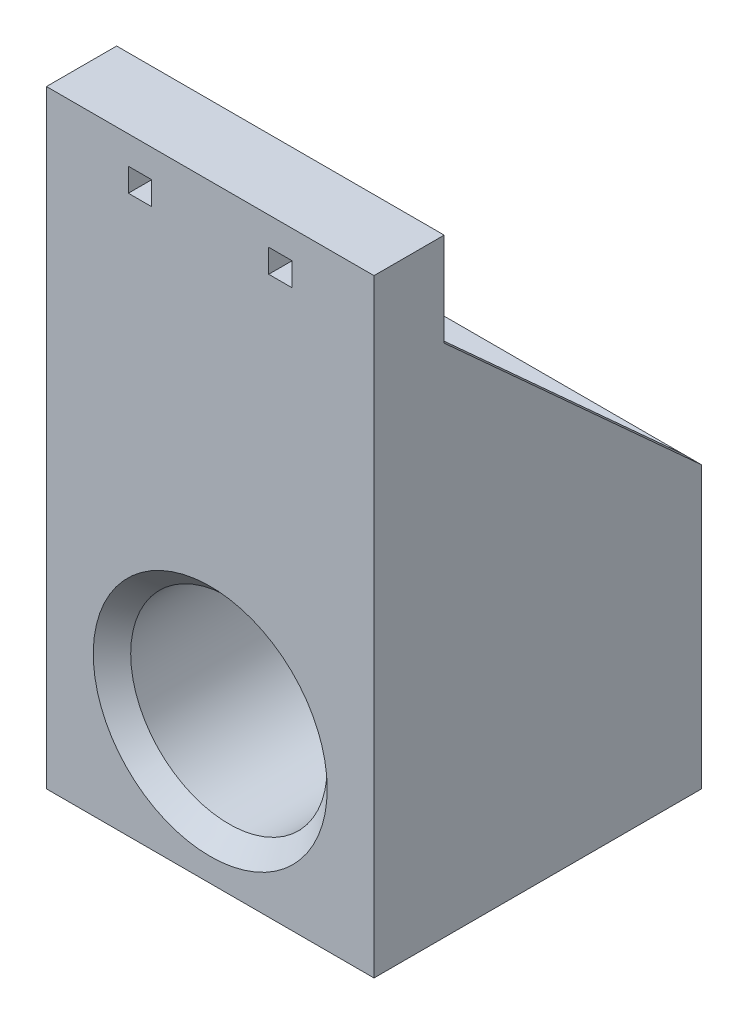
ISO-10303-21;
HEADER;
FILE_DESCRIPTION(('STEP AP214'),'2;1');
FILE_NAME('part.step','',(''),(''),'','','');
FILE_SCHEMA(('AUTOMOTIVE_DESIGN { 1 0 10303 214 1 1 1 1 }'));
ENDSEC;
DATA;
#1=APPLICATION_CONTEXT('core data for automotive mechanical design processes');
#2=APPLICATION_PROTOCOL_DEFINITION('international standard','automotive_design',2000,#1);
#3=PRODUCT_CONTEXT('',#1,'mechanical');
#4=PRODUCT('Part','Part','',(#3));
#5=PRODUCT_RELATED_PRODUCT_CATEGORY('part','',(#4));
#6=PRODUCT_DEFINITION_FORMATION('','',#4);
#7=PRODUCT_DEFINITION_CONTEXT('part definition',#1,'design');
#8=PRODUCT_DEFINITION('design','',#6,#7);
#9=PRODUCT_DEFINITION_SHAPE('','',#8);
#10=(LENGTH_UNIT() NAMED_UNIT(*) SI_UNIT(.MILLI.,.METRE.));
#11=(NAMED_UNIT(*) PLANE_ANGLE_UNIT() SI_UNIT($,.RADIAN.));
#12=(NAMED_UNIT(*) SI_UNIT($,.STERADIAN.) SOLID_ANGLE_UNIT());
#13=UNCERTAINTY_MEASURE_WITH_UNIT(LENGTH_MEASURE(1.E-05),#10,'distance_accuracy_value','');
#14=(GEOMETRIC_REPRESENTATION_CONTEXT(3) GLOBAL_UNCERTAINTY_ASSIGNED_CONTEXT((#13)) GLOBAL_UNIT_ASSIGNED_CONTEXT((#10,
#11,#12)) REPRESENTATION_CONTEXT('',''));
#15=CARTESIAN_POINT('',(0.,0.,0.));
#16=DIRECTION('',(0.,0.,1.));
#17=DIRECTION('',(1.,0.,0.));
#18=AXIS2_PLACEMENT_3D('',#15,#16,#17);
#19=CARTESIAN_POINT('',(35.,0.,35.));
#20=DIRECTION('',(0.,0.,1.));
#21=DIRECTION('',(0.,-1.,0.));
#22=AXIS2_PLACEMENT_3D('',#19,#20,#21);
#23=PLANE('',#22);
#24=DIRECTION('',(-1.,0.,0.));
#25=VECTOR('',#24,1.);
#26=CARTESIAN_POINT('',(17.5,94.,35.));
#27=LINE('',#26,#25);
#28=CARTESIAN_POINT('',(17.5,94.,35.));
#29=VERTEX_POINT('',#28);
#30=CARTESIAN_POINT('',(12.5,94.,35.));
#31=VERTEX_POINT('',#30);
#32=EDGE_CURVE('E60',#29,#31,#27,.T.);
#33=ORIENTED_EDGE('',*,*,#32,.F.);
#34=DIRECTION('',(0.,-1.,0.));
#35=VECTOR('',#34,1.);
#36=CARTESIAN_POINT('',(17.5,94.,35.));
#37=LINE('',#36,#35);
#38=CARTESIAN_POINT('',(17.5,89.,35.));
#39=VERTEX_POINT('',#38);
#40=EDGE_CURVE('E193',#29,#39,#37,.T.);
#41=ORIENTED_EDGE('',*,*,#40,.T.);
#42=DIRECTION('',(-1.,0.,0.));
#43=VECTOR('',#42,1.);
#44=CARTESIAN_POINT('',(17.5,89.,35.));
#45=LINE('',#44,#43);
#46=CARTESIAN_POINT('',(12.5,89.,35.));
#47=VERTEX_POINT('',#46);
#48=EDGE_CURVE('E197',#39,#47,#45,.T.);
#49=ORIENTED_EDGE('',*,*,#48,.T.);
#50=DIRECTION('',(0.,-1.,0.));
#51=VECTOR('',#50,1.);
#52=CARTESIAN_POINT('',(12.5,94.,35.));
#53=LINE('',#52,#51);
#54=EDGE_CURVE('E206',#31,#47,#53,.T.);
#55=ORIENTED_EDGE('',*,*,#54,.F.);
#56=EDGE_LOOP('',(#33,#41,#49,#55));
#57=FACE_BOUND('',#56,.T.);
#58=DIRECTION('',(-1.,0.,0.));
#59=VECTOR('',#58,1.);
#60=CARTESIAN_POINT('',(35.,100.,35.));
#61=LINE('',#60,#59);
#62=CARTESIAN_POINT('',(35.,100.,35.));
#63=VERTEX_POINT('',#62);
#64=CARTESIAN_POINT('',(-35.,100.,35.));
#65=VERTEX_POINT('',#64);
#66=EDGE_CURVE('E334',#63,#65,#61,.T.);
#67=ORIENTED_EDGE('',*,*,#66,.T.);
#68=DIRECTION('',(0.,1.,0.));
#69=VECTOR('',#68,1.);
#70=CARTESIAN_POINT('',(-35.,0.,35.));
#71=LINE('',#70,#69);
#72=CARTESIAN_POINT('',(-35.,-30.,35.));
#73=VERTEX_POINT('',#72);
#74=EDGE_CURVE('E311',#73,#65,#71,.T.);
#75=ORIENTED_EDGE('',*,*,#74,.F.);
#76=DIRECTION('',(-1.,0.,0.));
#77=VECTOR('',#76,1.);
#78=CARTESIAN_POINT('',(35.,-30.,35.));
#79=LINE('',#78,#77);
#80=CARTESIAN_POINT('',(35.,-30.,35.));
#81=VERTEX_POINT('',#80);
#82=EDGE_CURVE('E361',#81,#73,#79,.T.);
#83=ORIENTED_EDGE('',*,*,#82,.F.);
#84=DIRECTION('',(0.,1.,0.));
#85=VECTOR('',#84,1.);
#86=CARTESIAN_POINT('',(35.,0.,35.));
#87=LINE('',#86,#85);
#88=EDGE_CURVE('E320',#81,#63,#87,.T.);
#89=ORIENTED_EDGE('',*,*,#88,.T.);
#90=EDGE_LOOP('',(#67,#75,#83,#89));
#91=FACE_BOUND('',#90,.T.);
#92=CARTESIAN_POINT('',(0.,0.,35.));
#93=DIRECTION('',(0.,0.,1.));
#94=DIRECTION('',(0.,-1.,0.));
#95=AXIS2_PLACEMENT_3D('',#92,#93,#94);
#96=CIRCLE('',#95,25.);
#97=CARTESIAN_POINT('',(0.,-25.,35.));
#98=VERTEX_POINT('',#97);
#99=EDGE_CURVE('E364',#98,#98,#96,.F.);
#100=ORIENTED_EDGE('',*,*,#99,.T.);
#101=EDGE_LOOP('',(#100));
#102=FACE_BOUND('',#101,.T.);
#103=DIRECTION('',(-1.,0.,0.));
#104=VECTOR('',#103,1.);
#105=CARTESIAN_POINT('',(-12.5,94.,35.));
#106=LINE('',#105,#104);
#107=CARTESIAN_POINT('',(-12.5,94.,35.));
#108=VERTEX_POINT('',#107);
#109=CARTESIAN_POINT('',(-17.5,94.,35.));
#110=VERTEX_POINT('',#109);
#111=EDGE_CURVE('E234',#108,#110,#106,.T.);
#112=ORIENTED_EDGE('',*,*,#111,.F.);
#113=DIRECTION('',(0.,-1.,0.));
#114=VECTOR('',#113,1.);
#115=CARTESIAN_POINT('',(-12.5,94.,35.));
#116=LINE('',#115,#114);
#117=CARTESIAN_POINT('',(-12.5,89.,35.));
#118=VERTEX_POINT('',#117);
#119=EDGE_CURVE('E68',#108,#118,#116,.T.);
#120=ORIENTED_EDGE('',*,*,#119,.T.);
#121=DIRECTION('',(-1.,0.,0.));
#122=VECTOR('',#121,1.);
#123=CARTESIAN_POINT('',(-12.5,89.,35.));
#124=LINE('',#123,#122);
#125=CARTESIAN_POINT('',(-17.5,89.,35.));
#126=VERTEX_POINT('',#125);
#127=EDGE_CURVE('E243',#118,#126,#124,.T.);
#128=ORIENTED_EDGE('',*,*,#127,.T.);
#129=DIRECTION('',(0.,-1.,0.));
#130=VECTOR('',#129,1.);
#131=CARTESIAN_POINT('',(-17.5,94.,35.));
#132=LINE('',#131,#130);
#133=EDGE_CURVE('E238',#110,#126,#132,.T.);
#134=ORIENTED_EDGE('',*,*,#133,.F.);
#135=EDGE_LOOP('',(#112,#120,#128,#134));
#136=FACE_BOUND('',#135,.T.);
#137=ADVANCED_FACE('F43',(#57,#91,#102,#136),#23,.T.);
#138=CARTESIAN_POINT('',(35.,30.,0.));
#139=DIRECTION('',(0.,1.,0.));
#140=DIRECTION('',(0.,0.,1.));
#141=AXIS2_PLACEMENT_3D('',#138,#139,#140);
#142=PLANE('',#141);
#143=DIRECTION('',(-1.,0.,0.));
#144=VECTOR('',#143,1.);
#145=CARTESIAN_POINT('',(35.,30.,-35.));
#146=LINE('',#145,#144);
#147=CARTESIAN_POINT('',(31.,30.,-35.));
#148=VERTEX_POINT('',#147);
#149=CARTESIAN_POINT('',(-31.,30.,-35.));
#150=VERTEX_POINT('',#149);
#151=EDGE_CURVE('E354',#148,#150,#146,.T.);
#152=ORIENTED_EDGE('',*,*,#151,.T.);
#153=DIRECTION('',(0.,0.,1.));
#154=VECTOR('',#153,1.);
#155=CARTESIAN_POINT('',(-31.,30.,0.));
#156=LINE('',#155,#154);
#157=CARTESIAN_POINT('',(-31.,30.,30.));
#158=VERTEX_POINT('',#157);
#159=EDGE_CURVE('E266',#150,#158,#156,.T.);
#160=ORIENTED_EDGE('',*,*,#159,.T.);
#161=DIRECTION('',(-1.,0.,0.));
#162=VECTOR('',#161,1.);
#163=CARTESIAN_POINT('',(35.,30.,30.));
#164=LINE('',#163,#162);
#165=CARTESIAN_POINT('',(31.,30.,30.));
#166=VERTEX_POINT('',#165);
#167=EDGE_CURVE('E350',#166,#158,#164,.T.);
#168=ORIENTED_EDGE('',*,*,#167,.F.);
#169=DIRECTION('',(0.,0.,-1.));
#170=VECTOR('',#169,1.);
#171=CARTESIAN_POINT('',(31.,30.,0.));
#172=LINE('',#171,#170);
#173=EDGE_CURVE('E294',#166,#148,#172,.T.);
#174=ORIENTED_EDGE('',*,*,#173,.T.);
#175=EDGE_LOOP('',(#152,#160,#168,#174));
#176=FACE_BOUND('',#175,.T.);
#177=ADVANCED_FACE('F400',(#176),#142,.T.);
#178=CARTESIAN_POINT('',(35.,0.,30.));
#179=DIRECTION('',(0.,0.,1.));
#180=DIRECTION('',(1.,0.,0.));
#181=AXIS2_PLACEMENT_3D('',#178,#179,#180);
#182=PLANE('',#181);
#183=DIRECTION('',(0.,-1.,0.));
#184=VECTOR('',#183,1.);
#185=CARTESIAN_POINT('',(-31.,0.,30.));
#186=LINE('',#185,#184);
#187=CARTESIAN_POINT('',(-31.,80.,30.));
#188=VERTEX_POINT('',#187);
#189=EDGE_CURVE('E272',#188,#158,#186,.T.);
#190=ORIENTED_EDGE('',*,*,#189,.F.);
#191=DIRECTION('',(1.,0.,0.));
#192=VECTOR('',#191,1.);
#193=CARTESIAN_POINT('',(-35.,80.,30.));
#194=LINE('',#193,#192);
#195=CARTESIAN_POINT('',(31.,80.,30.));
#196=VERTEX_POINT('',#195);
#197=EDGE_CURVE('E303',#188,#196,#194,.T.);
#198=ORIENTED_EDGE('',*,*,#197,.T.);
#199=DIRECTION('',(0.,1.,0.));
#200=VECTOR('',#199,1.);
#201=CARTESIAN_POINT('',(31.,0.,30.));
#202=LINE('',#201,#200);
#203=EDGE_CURVE('E287',#166,#196,#202,.T.);
#204=ORIENTED_EDGE('',*,*,#203,.F.);
#205=ORIENTED_EDGE('',*,*,#167,.T.);
#206=EDGE_LOOP('',(#190,#198,#204,#205));
#207=FACE_BOUND('',#206,.T.);
#208=ADVANCED_FACE('F453',(#207),#182,.F.);
#209=CARTESIAN_POINT('',(-35.,80.,30.));
#210=DIRECTION('',(0.,-1.,0.));
#211=DIRECTION('',(0.,0.,-1.));
#212=AXIS2_PLACEMENT_3D('',#209,#210,#211);
#213=PLANE('',#212);
#214=ORIENTED_EDGE('',*,*,#197,.F.);
#215=DIRECTION('',(0.,0.,-1.));
#216=VECTOR('',#215,1.);
#217=CARTESIAN_POINT('',(-31.,80.,30.));
#218=LINE('',#217,#216);
#219=CARTESIAN_POINT('',(-31.,80.,20.));
#220=VERTEX_POINT('',#219);
#221=EDGE_CURVE('E276',#188,#220,#218,.T.);
#222=ORIENTED_EDGE('',*,*,#221,.T.);
#223=DIRECTION('',(1.,0.,0.));
#224=VECTOR('',#223,1.);
#225=CARTESIAN_POINT('',(-35.,80.,20.));
#226=LINE('',#225,#224);
#227=CARTESIAN_POINT('',(31.,80.,20.));
#228=VERTEX_POINT('',#227);
#229=EDGE_CURVE('E316',#220,#228,#226,.T.);
#230=ORIENTED_EDGE('',*,*,#229,.T.);
#231=DIRECTION('',(0.,0.,1.));
#232=VECTOR('',#231,1.);
#233=CARTESIAN_POINT('',(31.,80.,30.));
#234=LINE('',#233,#232);
#235=EDGE_CURVE('E11',#228,#196,#234,.T.);
#236=ORIENTED_EDGE('',*,*,#235,.T.);
#237=EDGE_LOOP('',(#214,#222,#230,#236));
#238=FACE_BOUND('',#237,.T.);
#239=ADVANCED_FACE('F450',(#238),#213,.T.);
#240=CARTESIAN_POINT('',(35.,-30.,0.));
#241=DIRECTION('',(0.,1.,0.));
#242=DIRECTION('',(0.,0.,1.));
#243=AXIS2_PLACEMENT_3D('',#240,#241,#242);
#244=PLANE('',#243);
#245=DIRECTION('',(0.,0.,-1.));
#246=VECTOR('',#245,1.);
#247=CARTESIAN_POINT('',(-35.,-30.,0.));
#248=LINE('',#247,#246);
#249=CARTESIAN_POINT('',(-35.,-30.,-35.));
#250=VERTEX_POINT('',#249);
#251=EDGE_CURVE('E337',#73,#250,#248,.T.);
#252=ORIENTED_EDGE('',*,*,#251,.T.);
#253=DIRECTION('',(-1.,0.,0.));
#254=VECTOR('',#253,1.);
#255=CARTESIAN_POINT('',(35.,-30.,-35.));
#256=LINE('',#255,#254);
#257=CARTESIAN_POINT('',(35.,-30.,-35.));
#258=VERTEX_POINT('',#257);
#259=EDGE_CURVE('E358',#258,#250,#256,.T.);
#260=ORIENTED_EDGE('',*,*,#259,.F.);
#261=DIRECTION('',(0.,0.,-1.));
#262=VECTOR('',#261,1.);
#263=CARTESIAN_POINT('',(35.,-30.,0.));
#264=LINE('',#263,#262);
#265=EDGE_CURVE('E323',#81,#258,#264,.T.);
#266=ORIENTED_EDGE('',*,*,#265,.F.);
#267=ORIENTED_EDGE('',*,*,#82,.T.);
#268=EDGE_LOOP('',(#252,#260,#266,#267));
#269=FACE_BOUND('',#268,.T.);
#270=ADVANCED_FACE('F452',(#269),#244,.F.);
#271=CARTESIAN_POINT('',(35.,0.,-35.));
#272=DIRECTION('',(0.,0.,-1.));
#273=DIRECTION('',(-1.,0.,0.));
#274=AXIS2_PLACEMENT_3D('',#271,#272,#273);
#275=PLANE('',#274);
#276=DIRECTION('',(1.,0.,0.));
#277=VECTOR('',#276,1.);
#278=CARTESIAN_POINT('',(35.,30.,-35.));
#279=LINE('',#278,#277);
#280=CARTESIAN_POINT('',(-35.,30.,-35.));
#281=VERTEX_POINT('',#280);
#282=EDGE_CURVE('E280',#281,#150,#279,.T.);
#283=ORIENTED_EDGE('',*,*,#282,.T.);
#284=ORIENTED_EDGE('',*,*,#151,.F.);
#285=CARTESIAN_POINT('',(35.,30.,-35.));
#286=VERTEX_POINT('',#285);
#287=EDGE_CURVE('E355',#286,#148,#146,.T.);
#288=ORIENTED_EDGE('',*,*,#287,.F.);
#289=DIRECTION('',(0.,-1.,0.));
#290=VECTOR('',#289,1.);
#291=CARTESIAN_POINT('',(35.,0.,-35.));
#292=LINE('',#291,#290);
#293=EDGE_CURVE('E327',#286,#258,#292,.T.);
#294=ORIENTED_EDGE('',*,*,#293,.T.);
#295=ORIENTED_EDGE('',*,*,#259,.T.);
#296=DIRECTION('',(0.,-1.,0.));
#297=VECTOR('',#296,1.);
#298=CARTESIAN_POINT('',(-35.,0.,-35.));
#299=LINE('',#298,#297);
#300=EDGE_CURVE('E341',#281,#250,#299,.T.);
#301=ORIENTED_EDGE('',*,*,#300,.F.);
#302=EDGE_LOOP('',(#283,#284,#288,#294,#295,#301));
#303=FACE_BOUND('',#302,.T.);
#304=CARTESIAN_POINT('',(0.,0.,-35.));
#305=DIRECTION('',(0.,0.,-1.));
#306=DIRECTION('',(-1.,0.,0.));
#307=AXIS2_PLACEMENT_3D('',#304,#305,#306);
#308=CIRCLE('',#307,25.0000000000001);
#309=CARTESIAN_POINT('',(-25.0000000000001,0.,-35.));
#310=VERTEX_POINT('',#309);
#311=EDGE_CURVE('E53',#310,#310,#308,.F.);
#312=ORIENTED_EDGE('',*,*,#311,.T.);
#313=EDGE_LOOP('',(#312));
#314=FACE_BOUND('',#313,.T.);
#315=ADVANCED_FACE('F379',(#303,#314),#275,.T.);
#316=CARTESIAN_POINT('',(35.,100.,0.));
#317=DIRECTION('',(0.,1.,0.));
#318=DIRECTION('',(0.,0.,1.));
#319=AXIS2_PLACEMENT_3D('',#316,#317,#318);
#320=PLANE('',#319);
#321=DIRECTION('',(0.,0.,-1.));
#322=VECTOR('',#321,1.);
#323=CARTESIAN_POINT('',(-35.,100.,0.));
#324=LINE('',#323,#322);
#325=CARTESIAN_POINT('',(-35.,100.,20.));
#326=VERTEX_POINT('',#325);
#327=EDGE_CURVE('E324',#65,#326,#324,.T.);
#328=ORIENTED_EDGE('',*,*,#327,.F.);
#329=ORIENTED_EDGE('',*,*,#66,.F.);
#330=DIRECTION('',(0.,0.,-1.));
#331=VECTOR('',#330,1.);
#332=CARTESIAN_POINT('',(35.,100.,0.));
#333=LINE('',#332,#331);
#334=CARTESIAN_POINT('',(35.,100.,20.));
#335=VERTEX_POINT('',#334);
#336=EDGE_CURVE('E331',#63,#335,#333,.T.);
#337=ORIENTED_EDGE('',*,*,#336,.T.);
#338=DIRECTION('',(1.,0.,0.));
#339=VECTOR('',#338,1.);
#340=CARTESIAN_POINT('',(-35.,100.,20.));
#341=LINE('',#340,#339);
#342=EDGE_CURVE('E307',#326,#335,#341,.T.);
#343=ORIENTED_EDGE('',*,*,#342,.F.);
#344=EDGE_LOOP('',(#328,#329,#337,#343));
#345=FACE_BOUND('',#344,.T.);
#346=ADVANCED_FACE('F459',(#345),#320,.T.);
#347=CARTESIAN_POINT('',(35.,0.,0.));
#348=DIRECTION('',(1.,0.,0.));
#349=DIRECTION('',(0.,0.,-1.));
#350=AXIS2_PLACEMENT_3D('',#347,#348,#349);
#351=PLANE('',#350);
#352=ORIENTED_EDGE('',*,*,#293,.F.);
#353=DIRECTION('',(0.,-0.672672793996312,-0.739940073395944));
#354=VECTOR('',#353,1.);
#355=CARTESIAN_POINT('',(35.,80.,20.));
#356=LINE('',#355,#354);
#357=CARTESIAN_POINT('',(35.,80.,20.));
#358=VERTEX_POINT('',#357);
#359=EDGE_CURVE('E284',#358,#286,#356,.T.);
#360=ORIENTED_EDGE('',*,*,#359,.F.);
#361=DIRECTION('',(0.,1.,0.));
#362=VECTOR('',#361,1.);
#363=CARTESIAN_POINT('',(35.,100.,20.));
#364=LINE('',#363,#362);
#365=EDGE_CURVE('E298',#358,#335,#364,.T.);
#366=ORIENTED_EDGE('',*,*,#365,.T.);
#367=ORIENTED_EDGE('',*,*,#336,.F.);
#368=ORIENTED_EDGE('',*,*,#88,.F.);
#369=ORIENTED_EDGE('',*,*,#265,.T.);
#370=EDGE_LOOP('',(#352,#360,#366,#367,#368,#369));
#371=FACE_BOUND('',#370,.T.);
#372=ADVANCED_FACE('F456',(#371),#351,.T.);
#373=CARTESIAN_POINT('',(-35.,0.,0.));
#374=DIRECTION('',(1.,0.,0.));
#375=DIRECTION('',(0.,0.,-1.));
#376=AXIS2_PLACEMENT_3D('',#373,#374,#375);
#377=PLANE('',#376);
#378=DIRECTION('',(0.,1.,0.));
#379=VECTOR('',#378,1.);
#380=CARTESIAN_POINT('',(-35.,100.,20.));
#381=LINE('',#380,#379);
#382=CARTESIAN_POINT('',(-35.,80.,20.));
#383=VERTEX_POINT('',#382);
#384=EDGE_CURVE('E299',#383,#326,#381,.T.);
#385=ORIENTED_EDGE('',*,*,#384,.F.);
#386=DIRECTION('',(0.,-0.672672793996312,-0.739940073395944));
#387=VECTOR('',#386,1.);
#388=CARTESIAN_POINT('',(-35.,80.,20.));
#389=LINE('',#388,#387);
#390=EDGE_CURVE('E262',#383,#281,#389,.T.);
#391=ORIENTED_EDGE('',*,*,#390,.T.);
#392=ORIENTED_EDGE('',*,*,#300,.T.);
#393=ORIENTED_EDGE('',*,*,#251,.F.);
#394=ORIENTED_EDGE('',*,*,#74,.T.);
#395=ORIENTED_EDGE('',*,*,#327,.T.);
#396=EDGE_LOOP('',(#385,#391,#392,#393,#394,#395));
#397=FACE_BOUND('',#396,.T.);
#398=ADVANCED_FACE('F390',(#397),#377,.F.);
#399=CARTESIAN_POINT('',(0.,0.,35.));
#400=DIRECTION('',(0.,0.,-1.));
#401=DIRECTION('',(-1.,0.,0.));
#402=AXIS2_PLACEMENT_3D('',#399,#400,#401);
#403=CYLINDRICAL_SURFACE('',#402,21.);
#404=CARTESIAN_POINT('',(0.,0.,-30.9999999999999));
#405=DIRECTION('',(0.,0.,-1.));
#406=DIRECTION('',(-1.,0.,0.));
#407=AXIS2_PLACEMENT_3D('',#404,#405,#406);
#408=CIRCLE('',#407,21.);
#409=CARTESIAN_POINT('',(-21.,0.,-30.9999999999999));
#410=VERTEX_POINT('',#409);
#411=EDGE_CURVE('E372',#410,#410,#408,.T.);
#412=ORIENTED_EDGE('',*,*,#411,.T.);
#413=EDGE_LOOP('',(#412));
#414=FACE_BOUND('',#413,.T.);
#415=CARTESIAN_POINT('',(0.,0.,31.));
#416=DIRECTION('',(0.,0.,1.));
#417=DIRECTION('',(1.,0.,0.));
#418=AXIS2_PLACEMENT_3D('',#415,#416,#417);
#419=CIRCLE('',#418,21.);
#420=CARTESIAN_POINT('',(21.,0.,31.));
#421=VERTEX_POINT('',#420);
#422=EDGE_CURVE('E368',#421,#421,#419,.T.);
#423=ORIENTED_EDGE('',*,*,#422,.T.);
#424=EDGE_LOOP('',(#423));
#425=FACE_BOUND('',#424,.T.);
#426=ADVANCED_FACE('F387',(#414,#425),#403,.F.);
#427=CARTESIAN_POINT('',(0.,0.,35.));
#428=DIRECTION('',(0.,0.,1.));
#429=DIRECTION('',(1.,0.,0.));
#430=AXIS2_PLACEMENT_3D('',#427,#428,#429);
#431=CONICAL_SURFACE('',#430,25.,0.785398163397446);
#432=ORIENTED_EDGE('',*,*,#422,.F.);
#433=EDGE_LOOP('',(#432));
#434=FACE_BOUND('',#433,.T.);
#435=ORIENTED_EDGE('',*,*,#99,.F.);
#436=EDGE_LOOP('',(#435));
#437=FACE_BOUND('',#436,.T.);
#438=ADVANCED_FACE('F384',(#434,#437),#431,.F.);
#439=CARTESIAN_POINT('',(0.,0.,-30.9999999999999));
#440=DIRECTION('',(0.,0.,-1.));
#441=DIRECTION('',(-1.,0.,0.));
#442=AXIS2_PLACEMENT_3D('',#439,#440,#441);
#443=CONICAL_SURFACE('',#442,21.,0.785398163397449);
#444=ORIENTED_EDGE('',*,*,#311,.F.);
#445=EDGE_LOOP('',(#444));
#446=FACE_BOUND('',#445,.T.);
#447=ORIENTED_EDGE('',*,*,#411,.F.);
#448=EDGE_LOOP('',(#447));
#449=FACE_BOUND('',#448,.T.);
#450=ADVANCED_FACE('F46',(#446,#449),#443,.F.);
#451=CARTESIAN_POINT('',(-35.,100.,20.));
#452=DIRECTION('',(0.,0.,-1.));
#453=DIRECTION('',(0.,1.,0.));
#454=AXIS2_PLACEMENT_3D('',#451,#452,#453);
#455=PLANE('',#454);
#456=ORIENTED_EDGE('',*,*,#365,.F.);
#457=EDGE_CURVE('E317',#228,#358,#226,.T.);
#458=ORIENTED_EDGE('',*,*,#457,.F.);
#459=ORIENTED_EDGE('',*,*,#229,.F.);
#460=EDGE_CURVE('E312',#383,#220,#226,.T.);
#461=ORIENTED_EDGE('',*,*,#460,.F.);
#462=ORIENTED_EDGE('',*,*,#384,.T.);
#463=ORIENTED_EDGE('',*,*,#342,.T.);
#464=EDGE_LOOP('',(#456,#458,#459,#461,#462,#463));
#465=FACE_BOUND('',#464,.T.);
#466=ADVANCED_FACE('F383',(#465),#455,.T.);
#467=CARTESIAN_POINT('',(35.,80.,20.));
#468=DIRECTION('',(0.,-0.739940073395944,0.672672793996312));
#469=DIRECTION('',(0.,-0.672672793996312,-0.739940073395944));
#470=AXIS2_PLACEMENT_3D('',#467,#468,#469);
#471=PLANE('',#470);
#472=ORIENTED_EDGE('',*,*,#359,.T.);
#473=ORIENTED_EDGE('',*,*,#287,.T.);
#474=DIRECTION('',(0.,-0.672672793996312,-0.739940073395944));
#475=VECTOR('',#474,1.);
#476=CARTESIAN_POINT('',(31.,80.,20.));
#477=LINE('',#476,#475);
#478=EDGE_CURVE('E283',#228,#148,#477,.T.);
#479=ORIENTED_EDGE('',*,*,#478,.F.);
#480=ORIENTED_EDGE('',*,*,#457,.T.);
#481=EDGE_LOOP('',(#472,#473,#479,#480));
#482=FACE_BOUND('',#481,.T.);
#483=ADVANCED_FACE('F442',(#482),#471,.F.);
#484=CARTESIAN_POINT('',(31.,35.,0.));
#485=DIRECTION('',(1.,0.,0.));
#486=DIRECTION('',(0.,0.,-1.));
#487=AXIS2_PLACEMENT_3D('',#484,#485,#486);
#488=PLANE('',#487);
#489=ORIENTED_EDGE('',*,*,#173,.F.);
#490=ORIENTED_EDGE('',*,*,#203,.T.);
#491=ORIENTED_EDGE('',*,*,#235,.F.);
#492=ORIENTED_EDGE('',*,*,#478,.T.);
#493=EDGE_LOOP('',(#489,#490,#491,#492));
#494=FACE_BOUND('',#493,.T.);
#495=ADVANCED_FACE('F438',(#494),#488,.F.);
#496=CARTESIAN_POINT('',(-35.,80.,20.));
#497=DIRECTION('',(0.,0.739940073395944,-0.672672793996312));
#498=DIRECTION('',(0.,-0.672672793996312,-0.739940073395944));
#499=AXIS2_PLACEMENT_3D('',#496,#497,#498);
#500=PLANE('',#499);
#501=ORIENTED_EDGE('',*,*,#282,.F.);
#502=ORIENTED_EDGE('',*,*,#390,.F.);
#503=ORIENTED_EDGE('',*,*,#460,.T.);
#504=DIRECTION('',(0.,-0.672672793996312,-0.739940073395944));
#505=VECTOR('',#504,1.);
#506=CARTESIAN_POINT('',(-31.,80.,20.));
#507=LINE('',#506,#505);
#508=EDGE_CURVE('E215',#220,#150,#507,.T.);
#509=ORIENTED_EDGE('',*,*,#508,.T.);
#510=EDGE_LOOP('',(#501,#502,#503,#509));
#511=FACE_BOUND('',#510,.T.);
#512=ADVANCED_FACE('F434',(#511),#500,.T.);
#513=CARTESIAN_POINT('',(-31.,35.,0.));
#514=DIRECTION('',(-1.,0.,0.));
#515=DIRECTION('',(0.,0.,1.));
#516=AXIS2_PLACEMENT_3D('',#513,#514,#515);
#517=PLANE('',#516);
#518=ORIENTED_EDGE('',*,*,#221,.F.);
#519=ORIENTED_EDGE('',*,*,#189,.T.);
#520=ORIENTED_EDGE('',*,*,#159,.F.);
#521=ORIENTED_EDGE('',*,*,#508,.F.);
#522=EDGE_LOOP('',(#518,#519,#520,#521));
#523=FACE_BOUND('',#522,.T.);
#524=ADVANCED_FACE('F431',(#523),#517,.F.);
#525=CARTESIAN_POINT('',(-12.5,94.,25.));
#526=DIRECTION('',(-1.,0.,0.));
#527=DIRECTION('',(0.,-1.,0.));
#528=AXIS2_PLACEMENT_3D('',#525,#526,#527);
#529=PLANE('',#528);
#530=ORIENTED_EDGE('',*,*,#119,.F.);
#531=DIRECTION('',(0.,0.,1.));
#532=VECTOR('',#531,1.);
#533=CARTESIAN_POINT('',(-12.5,94.,25.));
#534=LINE('',#533,#532);
#535=CARTESIAN_POINT('',(-12.5,94.,25.));
#536=VERTEX_POINT('',#535);
#537=EDGE_CURVE('E230',#536,#108,#534,.T.);
#538=ORIENTED_EDGE('',*,*,#537,.F.);
#539=DIRECTION('',(0.,-1.,0.));
#540=VECTOR('',#539,1.);
#541=CARTESIAN_POINT('',(-12.5,94.,25.));
#542=LINE('',#541,#540);
#543=CARTESIAN_POINT('',(-12.5,89.,25.));
#544=VERTEX_POINT('',#543);
#545=EDGE_CURVE('E239',#536,#544,#542,.T.);
#546=ORIENTED_EDGE('',*,*,#545,.T.);
#547=DIRECTION('',(0.,0.,1.));
#548=VECTOR('',#547,1.);
#549=CARTESIAN_POINT('',(-12.5,89.,25.));
#550=LINE('',#549,#548);
#551=EDGE_CURVE('E221',#544,#118,#550,.T.);
#552=ORIENTED_EDGE('',*,*,#551,.T.);
#553=EDGE_LOOP('',(#530,#538,#546,#552));
#554=FACE_BOUND('',#553,.T.);
#555=ADVANCED_FACE('F410',(#554),#529,.T.);
#556=CARTESIAN_POINT('',(-12.5,89.,25.));
#557=DIRECTION('',(0.,1.,0.));
#558=DIRECTION('',(0.,0.,1.));
#559=AXIS2_PLACEMENT_3D('',#556,#557,#558);
#560=PLANE('',#559);
#561=ORIENTED_EDGE('',*,*,#127,.F.);
#562=ORIENTED_EDGE('',*,*,#551,.F.);
#563=DIRECTION('',(-1.,0.,0.));
#564=VECTOR('',#563,1.);
#565=CARTESIAN_POINT('',(-12.5,89.,25.));
#566=LINE('',#565,#564);
#567=CARTESIAN_POINT('',(-17.5,89.,25.));
#568=VERTEX_POINT('',#567);
#569=EDGE_CURVE('E256',#544,#568,#566,.T.);
#570=ORIENTED_EDGE('',*,*,#569,.T.);
#571=DIRECTION('',(0.,0.,1.));
#572=VECTOR('',#571,1.);
#573=CARTESIAN_POINT('',(-17.5,89.,25.));
#574=LINE('',#573,#572);
#575=EDGE_CURVE('E224',#568,#126,#574,.T.);
#576=ORIENTED_EDGE('',*,*,#575,.T.);
#577=EDGE_LOOP('',(#561,#562,#570,#576));
#578=FACE_BOUND('',#577,.T.);
#579=ADVANCED_FACE('F416',(#578),#560,.T.);
#580=CARTESIAN_POINT('',(-17.5,94.,25.));
#581=DIRECTION('',(-1.,0.,0.));
#582=DIRECTION('',(0.,0.,1.));
#583=AXIS2_PLACEMENT_3D('',#580,#581,#582);
#584=PLANE('',#583);
#585=ORIENTED_EDGE('',*,*,#133,.T.);
#586=ORIENTED_EDGE('',*,*,#575,.F.);
#587=DIRECTION('',(0.,-1.,0.));
#588=VECTOR('',#587,1.);
#589=CARTESIAN_POINT('',(-17.5,94.,25.));
#590=LINE('',#589,#588);
#591=CARTESIAN_POINT('',(-17.5,94.,25.));
#592=VERTEX_POINT('',#591);
#593=EDGE_CURVE('E252',#592,#568,#590,.T.);
#594=ORIENTED_EDGE('',*,*,#593,.F.);
#595=DIRECTION('',(0.,0.,1.));
#596=VECTOR('',#595,1.);
#597=CARTESIAN_POINT('',(-17.5,94.,25.));
#598=LINE('',#597,#596);
#599=EDGE_CURVE('E227',#592,#110,#598,.T.);
#600=ORIENTED_EDGE('',*,*,#599,.T.);
#601=EDGE_LOOP('',(#585,#586,#594,#600));
#602=FACE_BOUND('',#601,.T.);
#603=ADVANCED_FACE('F418',(#602),#584,.F.);
#604=CARTESIAN_POINT('',(-12.5,94.,25.));
#605=DIRECTION('',(0.,1.,0.));
#606=DIRECTION('',(0.,0.,1.));
#607=AXIS2_PLACEMENT_3D('',#604,#605,#606);
#608=PLANE('',#607);
#609=ORIENTED_EDGE('',*,*,#111,.T.);
#610=ORIENTED_EDGE('',*,*,#599,.F.);
#611=DIRECTION('',(-1.,0.,0.));
#612=VECTOR('',#611,1.);
#613=CARTESIAN_POINT('',(-12.5,94.,25.));
#614=LINE('',#613,#612);
#615=EDGE_CURVE('E233',#536,#592,#614,.T.);
#616=ORIENTED_EDGE('',*,*,#615,.F.);
#617=ORIENTED_EDGE('',*,*,#537,.T.);
#618=EDGE_LOOP('',(#609,#610,#616,#617));
#619=FACE_BOUND('',#618,.T.);
#620=ADVANCED_FACE('F406',(#619),#608,.F.);
#621=CARTESIAN_POINT('',(0.,0.,25.));
#622=DIRECTION('',(0.,0.,-1.));
#623=DIRECTION('',(-1.,0.,0.));
#624=AXIS2_PLACEMENT_3D('',#621,#622,#623);
#625=PLANE('',#624);
#626=ORIENTED_EDGE('',*,*,#545,.F.);
#627=ORIENTED_EDGE('',*,*,#615,.T.);
#628=ORIENTED_EDGE('',*,*,#593,.T.);
#629=ORIENTED_EDGE('',*,*,#569,.F.);
#630=EDGE_LOOP('',(#626,#627,#628,#629));
#631=FACE_BOUND('',#630,.T.);
#632=ADVANCED_FACE('F413',(#631),#625,.F.);
#633=CARTESIAN_POINT('',(17.5,94.,25.));
#634=DIRECTION('',(0.,1.,0.));
#635=DIRECTION('',(0.,0.,1.));
#636=AXIS2_PLACEMENT_3D('',#633,#634,#635);
#637=PLANE('',#636);
#638=ORIENTED_EDGE('',*,*,#32,.T.);
#639=DIRECTION('',(0.,0.,1.));
#640=VECTOR('',#639,1.);
#641=CARTESIAN_POINT('',(12.5,94.,25.));
#642=LINE('',#641,#640);
#643=CARTESIAN_POINT('',(12.5,94.,25.));
#644=VERTEX_POINT('',#643);
#645=EDGE_CURVE('E169',#644,#31,#642,.T.);
#646=ORIENTED_EDGE('',*,*,#645,.F.);
#647=DIRECTION('',(-1.,0.,0.));
#648=VECTOR('',#647,1.);
#649=CARTESIAN_POINT('',(17.5,94.,25.));
#650=LINE('',#649,#648);
#651=CARTESIAN_POINT('',(17.5,94.,25.));
#652=VERTEX_POINT('',#651);
#653=EDGE_CURVE('E173',#652,#644,#650,.T.);
#654=ORIENTED_EDGE('',*,*,#653,.F.);
#655=DIRECTION('',(0.,0.,1.));
#656=VECTOR('',#655,1.);
#657=CARTESIAN_POINT('',(17.5,94.,25.));
#658=LINE('',#657,#656);
#659=EDGE_CURVE('E212',#652,#29,#658,.T.);
#660=ORIENTED_EDGE('',*,*,#659,.T.);
#661=EDGE_LOOP('',(#638,#646,#654,#660));
#662=FACE_BOUND('',#661,.T.);
#663=ADVANCED_FACE('F171',(#662),#637,.F.);
#664=CARTESIAN_POINT('',(17.5,94.,25.));
#665=DIRECTION('',(-1.,0.,0.));
#666=DIRECTION('',(0.,-1.,0.));
#667=AXIS2_PLACEMENT_3D('',#664,#665,#666);
#668=PLANE('',#667);
#669=ORIENTED_EDGE('',*,*,#40,.F.);
#670=ORIENTED_EDGE('',*,*,#659,.F.);
#671=DIRECTION('',(0.,-1.,0.));
#672=VECTOR('',#671,1.);
#673=CARTESIAN_POINT('',(17.5,94.,25.));
#674=LINE('',#673,#672);
#675=CARTESIAN_POINT('',(17.5,89.,25.));
#676=VERTEX_POINT('',#675);
#677=EDGE_CURVE('E179',#652,#676,#674,.T.);
#678=ORIENTED_EDGE('',*,*,#677,.T.);
#679=DIRECTION('',(0.,0.,1.));
#680=VECTOR('',#679,1.);
#681=CARTESIAN_POINT('',(17.5,89.,25.));
#682=LINE('',#681,#680);
#683=EDGE_CURVE('E216',#676,#39,#682,.T.);
#684=ORIENTED_EDGE('',*,*,#683,.T.);
#685=EDGE_LOOP('',(#669,#670,#678,#684));
#686=FACE_BOUND('',#685,.T.);
#687=ADVANCED_FACE('F602',(#686),#668,.T.);
#688=CARTESIAN_POINT('',(17.5,89.,25.));
#689=DIRECTION('',(0.,1.,0.));
#690=DIRECTION('',(0.,0.,1.));
#691=AXIS2_PLACEMENT_3D('',#688,#689,#690);
#692=PLANE('',#691);
#693=ORIENTED_EDGE('',*,*,#48,.F.);
#694=ORIENTED_EDGE('',*,*,#683,.F.);
#695=DIRECTION('',(-1.,0.,0.));
#696=VECTOR('',#695,1.);
#697=CARTESIAN_POINT('',(17.5,89.,25.));
#698=LINE('',#697,#696);
#699=CARTESIAN_POINT('',(12.5,89.,25.));
#700=VERTEX_POINT('',#699);
#701=EDGE_CURVE('E188',#676,#700,#698,.T.);
#702=ORIENTED_EDGE('',*,*,#701,.T.);
#703=DIRECTION('',(0.,0.,1.));
#704=VECTOR('',#703,1.);
#705=CARTESIAN_POINT('',(12.5,89.,25.));
#706=LINE('',#705,#704);
#707=EDGE_CURVE('E178',#700,#47,#706,.T.);
#708=ORIENTED_EDGE('',*,*,#707,.T.);
#709=EDGE_LOOP('',(#693,#694,#702,#708));
#710=FACE_BOUND('',#709,.T.);
#711=ADVANCED_FACE('F611',(#710),#692,.T.);
#712=CARTESIAN_POINT('',(12.5,94.,25.));
#713=DIRECTION('',(-1.,0.,0.));
#714=DIRECTION('',(0.,0.,1.));
#715=AXIS2_PLACEMENT_3D('',#712,#713,#714);
#716=PLANE('',#715);
#717=ORIENTED_EDGE('',*,*,#54,.T.);
#718=ORIENTED_EDGE('',*,*,#707,.F.);
#719=DIRECTION('',(0.,-1.,0.));
#720=VECTOR('',#719,1.);
#721=CARTESIAN_POINT('',(12.5,94.,25.));
#722=LINE('',#721,#720);
#723=EDGE_CURVE('E183',#644,#700,#722,.T.);
#724=ORIENTED_EDGE('',*,*,#723,.F.);
#725=ORIENTED_EDGE('',*,*,#645,.T.);
#726=EDGE_LOOP('',(#717,#718,#724,#725));
#727=FACE_BOUND('',#726,.T.);
#728=ADVANCED_FACE('F184',(#727),#716,.F.);
#729=CARTESIAN_POINT('',(0.,0.,25.));
#730=DIRECTION('',(0.,0.,1.));
#731=DIRECTION('',(1.,0.,0.));
#732=AXIS2_PLACEMENT_3D('',#729,#730,#731);
#733=PLANE('',#732);
#734=ORIENTED_EDGE('',*,*,#653,.T.);
#735=ORIENTED_EDGE('',*,*,#723,.T.);
#736=ORIENTED_EDGE('',*,*,#701,.F.);
#737=ORIENTED_EDGE('',*,*,#677,.F.);
#738=EDGE_LOOP('',(#734,#735,#736,#737));
#739=FACE_BOUND('',#738,.T.);
#740=ADVANCED_FACE('F191',(#739),#733,.T.);
#741=CLOSED_SHELL('',(#137,#177,#208,#239,#270,#315,#346,#372,#398,#426,#438,#450,#466,#483,
#495,#512,#524,#555,#579,#603,#620,#632,#663,#687,#711,#728,#740));
#742=MANIFOLD_SOLID_BREP('B2',#741);
#743=ADVANCED_BREP_SHAPE_REPRESENTATION('',(#18,#742),#14);
#744=SHAPE_DEFINITION_REPRESENTATION(#9,#743);
ENDSEC;
END-ISO-10303-21;
